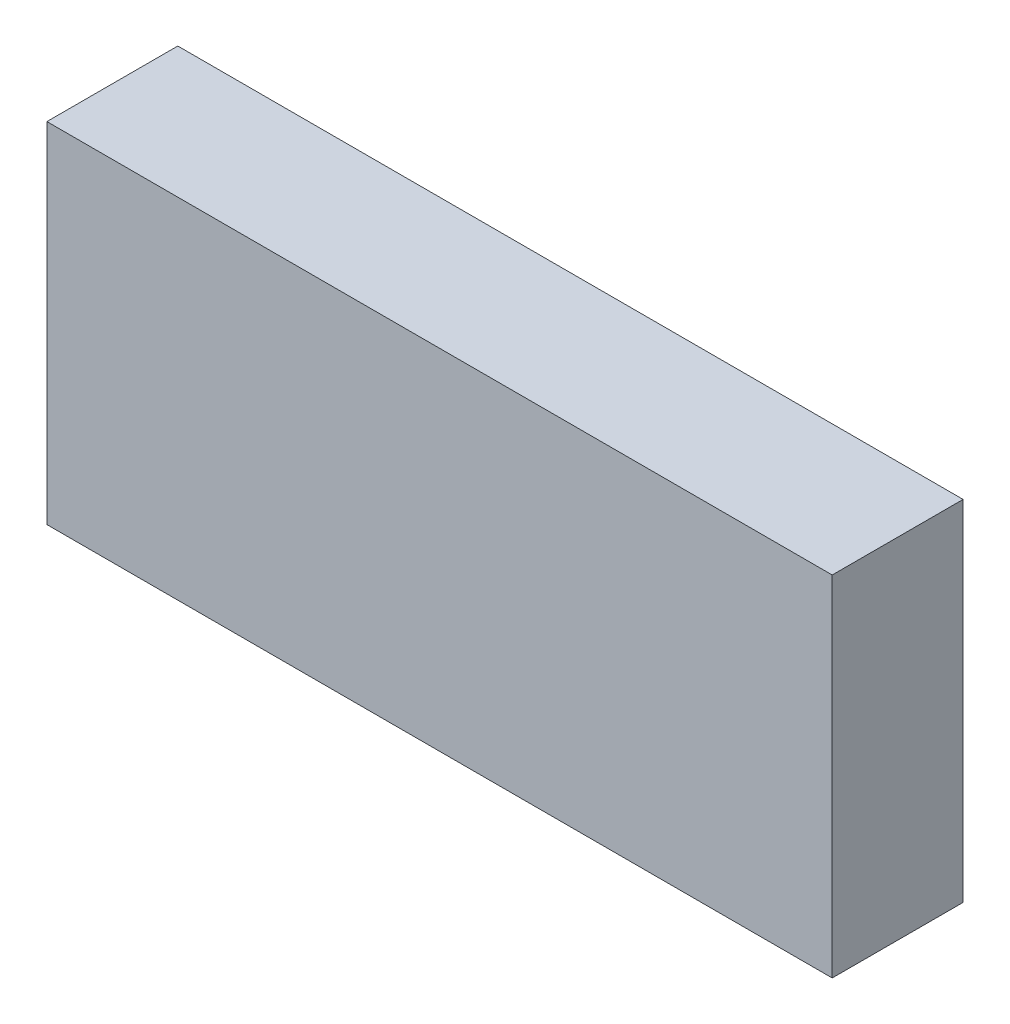
ISO-10303-21;
HEADER;
FILE_DESCRIPTION(('STEP AP214'),'2;1');
FILE_NAME('part.step','',(''),(''),'','','');
FILE_SCHEMA(('AUTOMOTIVE_DESIGN { 1 0 10303 214 1 1 1 1 }'));
ENDSEC;
DATA;
#1=APPLICATION_CONTEXT('core data for automotive mechanical design processes');
#2=APPLICATION_PROTOCOL_DEFINITION('international standard','automotive_design',2000,#1);
#3=PRODUCT_CONTEXT('',#1,'mechanical');
#4=PRODUCT('Part','Part','',(#3));
#5=PRODUCT_RELATED_PRODUCT_CATEGORY('part','',(#4));
#6=PRODUCT_DEFINITION_FORMATION('','',#4);
#7=PRODUCT_DEFINITION_CONTEXT('part definition',#1,'design');
#8=PRODUCT_DEFINITION('design','',#6,#7);
#9=PRODUCT_DEFINITION_SHAPE('','',#8);
#10=(LENGTH_UNIT() NAMED_UNIT(*) SI_UNIT(.MILLI.,.METRE.));
#11=(NAMED_UNIT(*) PLANE_ANGLE_UNIT() SI_UNIT($,.RADIAN.));
#12=(NAMED_UNIT(*) SI_UNIT($,.STERADIAN.) SOLID_ANGLE_UNIT());
#13=UNCERTAINTY_MEASURE_WITH_UNIT(LENGTH_MEASURE(1.E-05),#10,'distance_accuracy_value','');
#14=(GEOMETRIC_REPRESENTATION_CONTEXT(3) GLOBAL_UNCERTAINTY_ASSIGNED_CONTEXT((#13)) GLOBAL_UNIT_ASSIGNED_CONTEXT((#10,
#11,#12)) REPRESENTATION_CONTEXT('',''));
#15=CARTESIAN_POINT('',(0.,0.,0.));
#16=DIRECTION('',(0.,0.,1.));
#17=DIRECTION('',(1.,0.,0.));
#18=AXIS2_PLACEMENT_3D('',#15,#16,#17);
#19=CARTESIAN_POINT('',(0.,0.,150.));
#20=DIRECTION('',(1.,0.,0.));
#21=DIRECTION('',(0.,0.,-1.));
#22=AXIS2_PLACEMENT_3D('',#19,#20,#21);
#23=PLANE('',#22);
#24=DIRECTION('',(0.,-1.,0.));
#25=VECTOR('',#24,1.);
#26=CARTESIAN_POINT('',(0.,0.,0.));
#27=LINE('',#26,#25);
#28=CARTESIAN_POINT('',(0.,400.,0.));
#29=VERTEX_POINT('',#28);
#30=CARTESIAN_POINT('',(0.,0.,0.));
#31=VERTEX_POINT('',#30);
#32=EDGE_CURVE('E107',#29,#31,#27,.T.);
#33=ORIENTED_EDGE('',*,*,#32,.T.);
#34=DIRECTION('',(0.,0.,-1.));
#35=VECTOR('',#34,1.);
#36=CARTESIAN_POINT('',(0.,0.,150.));
#37=LINE('',#36,#35);
#38=CARTESIAN_POINT('',(0.,0.,150.));
#39=VERTEX_POINT('',#38);
#40=EDGE_CURVE('E11',#39,#31,#37,.T.);
#41=ORIENTED_EDGE('',*,*,#40,.F.);
#42=DIRECTION('',(0.,-1.,0.));
#43=VECTOR('',#42,1.);
#44=CARTESIAN_POINT('',(0.,0.,150.));
#45=LINE('',#44,#43);
#46=CARTESIAN_POINT('',(0.,400.,150.));
#47=VERTEX_POINT('',#46);
#48=EDGE_CURVE('E91',#47,#39,#45,.T.);
#49=ORIENTED_EDGE('',*,*,#48,.F.);
#50=DIRECTION('',(0.,0.,-1.));
#51=VECTOR('',#50,1.);
#52=CARTESIAN_POINT('',(0.,400.,150.));
#53=LINE('',#52,#51);
#54=EDGE_CURVE('E103',#47,#29,#53,.T.);
#55=ORIENTED_EDGE('',*,*,#54,.T.);
#56=EDGE_LOOP('',(#33,#41,#49,#55));
#57=FACE_BOUND('',#56,.T.);
#58=ADVANCED_FACE('F39',(#57),#23,.F.);
#59=CARTESIAN_POINT('',(0.,0.,150.));
#60=DIRECTION('',(0.,1.,0.));
#61=DIRECTION('',(0.,0.,1.));
#62=AXIS2_PLACEMENT_3D('',#59,#60,#61);
#63=PLANE('',#62);
#64=DIRECTION('',(1.,0.,0.));
#65=VECTOR('',#64,1.);
#66=CARTESIAN_POINT('',(0.,0.,0.));
#67=LINE('',#66,#65);
#68=CARTESIAN_POINT('',(900.,0.,0.));
#69=VERTEX_POINT('',#68);
#70=EDGE_CURVE('E96',#31,#69,#67,.T.);
#71=ORIENTED_EDGE('',*,*,#70,.T.);
#72=DIRECTION('',(0.,0.,-1.));
#73=VECTOR('',#72,1.);
#74=CARTESIAN_POINT('',(900.,0.,150.));
#75=LINE('',#74,#73);
#76=CARTESIAN_POINT('',(900.,0.,150.));
#77=VERTEX_POINT('',#76);
#78=EDGE_CURVE('E48',#77,#69,#75,.T.);
#79=ORIENTED_EDGE('',*,*,#78,.F.);
#80=DIRECTION('',(1.,0.,0.));
#81=VECTOR('',#80,1.);
#82=CARTESIAN_POINT('',(0.,0.,150.));
#83=LINE('',#82,#81);
#84=EDGE_CURVE('E86',#39,#77,#83,.T.);
#85=ORIENTED_EDGE('',*,*,#84,.F.);
#86=ORIENTED_EDGE('',*,*,#40,.T.);
#87=EDGE_LOOP('',(#71,#79,#85,#86));
#88=FACE_BOUND('',#87,.T.);
#89=ADVANCED_FACE('F95',(#88),#63,.F.);
#90=CARTESIAN_POINT('',(900.,0.,150.));
#91=DIRECTION('',(-1.,0.,0.));
#92=DIRECTION('',(0.,0.,1.));
#93=AXIS2_PLACEMENT_3D('',#90,#91,#92);
#94=PLANE('',#93);
#95=DIRECTION('',(0.,1.,0.));
#96=VECTOR('',#95,1.);
#97=CARTESIAN_POINT('',(900.,0.,0.));
#98=LINE('',#97,#96);
#99=CARTESIAN_POINT('',(900.,400.,0.));
#100=VERTEX_POINT('',#99);
#101=EDGE_CURVE('E73',#69,#100,#98,.T.);
#102=ORIENTED_EDGE('',*,*,#101,.T.);
#103=DIRECTION('',(0.,0.,-1.));
#104=VECTOR('',#103,1.);
#105=CARTESIAN_POINT('',(900.,400.,150.));
#106=LINE('',#105,#104);
#107=CARTESIAN_POINT('',(900.,400.,150.));
#108=VERTEX_POINT('',#107);
#109=EDGE_CURVE('E98',#108,#100,#106,.T.);
#110=ORIENTED_EDGE('',*,*,#109,.F.);
#111=DIRECTION('',(0.,1.,0.));
#112=VECTOR('',#111,1.);
#113=CARTESIAN_POINT('',(900.,0.,150.));
#114=LINE('',#113,#112);
#115=EDGE_CURVE('E89',#77,#108,#114,.T.);
#116=ORIENTED_EDGE('',*,*,#115,.F.);
#117=ORIENTED_EDGE('',*,*,#78,.T.);
#118=EDGE_LOOP('',(#102,#110,#116,#117));
#119=FACE_BOUND('',#118,.T.);
#120=ADVANCED_FACE('F99',(#119),#94,.F.);
#121=CARTESIAN_POINT('',(0.,400.,150.));
#122=DIRECTION('',(0.,-1.,0.));
#123=DIRECTION('',(0.,0.,-1.));
#124=AXIS2_PLACEMENT_3D('',#121,#122,#123);
#125=PLANE('',#124);
#126=DIRECTION('',(-1.,0.,0.));
#127=VECTOR('',#126,1.);
#128=CARTESIAN_POINT('',(0.,400.,0.));
#129=LINE('',#128,#127);
#130=EDGE_CURVE('E79',#100,#29,#129,.T.);
#131=ORIENTED_EDGE('',*,*,#130,.T.);
#132=ORIENTED_EDGE('',*,*,#54,.F.);
#133=DIRECTION('',(-1.,0.,0.));
#134=VECTOR('',#133,1.);
#135=CARTESIAN_POINT('',(0.,400.,150.));
#136=LINE('',#135,#134);
#137=EDGE_CURVE('E56',#108,#47,#136,.T.);
#138=ORIENTED_EDGE('',*,*,#137,.F.);
#139=ORIENTED_EDGE('',*,*,#109,.T.);
#140=EDGE_LOOP('',(#131,#132,#138,#139));
#141=FACE_BOUND('',#140,.T.);
#142=ADVANCED_FACE('F120',(#141),#125,.F.);
#143=CARTESIAN_POINT('',(0.,0.,150.));
#144=DIRECTION('',(0.,0.,-1.));
#145=DIRECTION('',(-1.,0.,0.));
#146=AXIS2_PLACEMENT_3D('',#143,#144,#145);
#147=PLANE('',#146);
#148=ORIENTED_EDGE('',*,*,#48,.T.);
#149=ORIENTED_EDGE('',*,*,#84,.T.);
#150=ORIENTED_EDGE('',*,*,#115,.T.);
#151=ORIENTED_EDGE('',*,*,#137,.T.);
#152=EDGE_LOOP('',(#148,#149,#150,#151));
#153=FACE_BOUND('',#152,.T.);
#154=ADVANCED_FACE('F87',(#153),#147,.F.);
#155=CARTESIAN_POINT('',(0.,0.,0.));
#156=DIRECTION('',(0.,0.,-1.));
#157=DIRECTION('',(-1.,0.,0.));
#158=AXIS2_PLACEMENT_3D('',#155,#156,#157);
#159=PLANE('',#158);
#160=ORIENTED_EDGE('',*,*,#32,.F.);
#161=ORIENTED_EDGE('',*,*,#130,.F.);
#162=ORIENTED_EDGE('',*,*,#101,.F.);
#163=ORIENTED_EDGE('',*,*,#70,.F.);
#164=EDGE_LOOP('',(#160,#161,#162,#163));
#165=FACE_BOUND('',#164,.T.);
#166=ADVANCED_FACE('F123',(#165),#159,.T.);
#167=CLOSED_SHELL('',(#58,#89,#120,#142,#154,#166));
#168=MANIFOLD_SOLID_BREP('B2',#167);
#169=ADVANCED_BREP_SHAPE_REPRESENTATION('',(#18,#168),#14);
#170=SHAPE_DEFINITION_REPRESENTATION(#9,#169);
ENDSEC;
END-ISO-10303-21;
